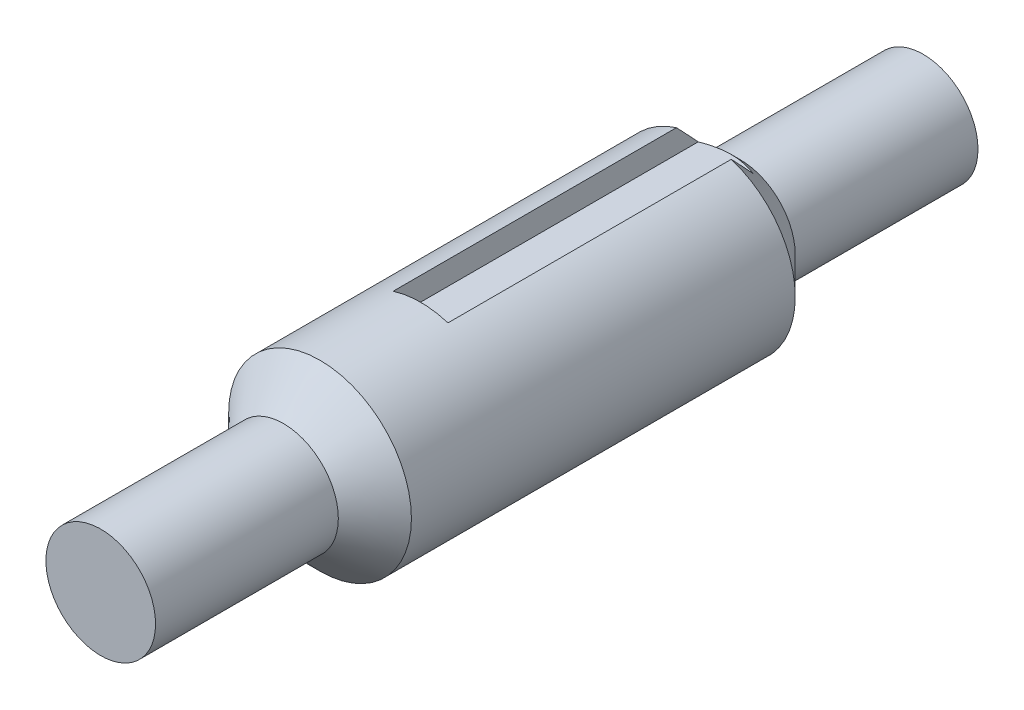
ISO-10303-21;
HEADER;
FILE_DESCRIPTION(('STEP AP214'),'2;1');
FILE_NAME('part.step','',(''),(''),'','','');
FILE_SCHEMA(('AUTOMOTIVE_DESIGN { 1 0 10303 214 1 1 1 1 }'));
ENDSEC;
DATA;
#1=APPLICATION_CONTEXT('core data for automotive mechanical design processes');
#2=APPLICATION_PROTOCOL_DEFINITION('international standard','automotive_design',2000,#1);
#3=PRODUCT_CONTEXT('',#1,'mechanical');
#4=PRODUCT('Part','Part','',(#3));
#5=PRODUCT_RELATED_PRODUCT_CATEGORY('part','',(#4));
#6=PRODUCT_DEFINITION_FORMATION('','',#4);
#7=PRODUCT_DEFINITION_CONTEXT('part definition',#1,'design');
#8=PRODUCT_DEFINITION('design','',#6,#7);
#9=PRODUCT_DEFINITION_SHAPE('','',#8);
#10=(LENGTH_UNIT() NAMED_UNIT(*) SI_UNIT(.MILLI.,.METRE.));
#11=(NAMED_UNIT(*) PLANE_ANGLE_UNIT() SI_UNIT($,.RADIAN.));
#12=(NAMED_UNIT(*) SI_UNIT($,.STERADIAN.) SOLID_ANGLE_UNIT());
#13=UNCERTAINTY_MEASURE_WITH_UNIT(LENGTH_MEASURE(1.E-05),#10,'distance_accuracy_value','');
#14=(GEOMETRIC_REPRESENTATION_CONTEXT(3) GLOBAL_UNCERTAINTY_ASSIGNED_CONTEXT((#13)) GLOBAL_UNIT_ASSIGNED_CONTEXT((#10,
#11,#12)) REPRESENTATION_CONTEXT('',''));
#15=CARTESIAN_POINT('',(0.,0.,0.));
#16=DIRECTION('',(0.,0.,1.));
#17=DIRECTION('',(1.,0.,0.));
#18=AXIS2_PLACEMENT_3D('',#15,#16,#17);
#19=CARTESIAN_POINT('',(0.,0.,30.));
#20=DIRECTION('',(0.,0.,-1.));
#21=DIRECTION('',(-1.,0.,0.));
#22=AXIS2_PLACEMENT_3D('',#19,#20,#21);
#23=CYLINDRICAL_SURFACE('',#22,10.);
#24=CARTESIAN_POINT('',(0.,0.,36.0000000000001));
#25=DIRECTION('',(0.,0.,-1.));
#26=DIRECTION('',(-1.,0.,0.));
#27=AXIS2_PLACEMENT_3D('',#24,#25,#26);
#28=CIRCLE('',#27,10.);
#29=CARTESIAN_POINT('',(-10.,0.,36.0000000000001));
#30=VERTEX_POINT('',#29);
#31=EDGE_CURVE('E11',#30,#30,#28,.T.);
#32=ORIENTED_EDGE('',*,*,#31,.T.);
#33=EDGE_LOOP('',(#32));
#34=FACE_BOUND('',#33,.T.);
#35=CARTESIAN_POINT('',(0.,0.,-6.00000000000012));
#36=DIRECTION('',(0.,0.,1.));
#37=DIRECTION('',(1.,0.,0.));
#38=AXIS2_PLACEMENT_3D('',#35,#36,#37);
#39=CIRCLE('',#38,10.);
#40=CARTESIAN_POINT('',(-3.,9.53939201416946,-6.00000000000012));
#41=VERTEX_POINT('',#40);
#42=CARTESIAN_POINT('',(3.,9.53939201416946,-6.00000000000012));
#43=VERTEX_POINT('',#42);
#44=EDGE_CURVE('E115',#41,#43,#39,.T.);
#45=ORIENTED_EDGE('',*,*,#44,.T.);
#46=DIRECTION('',(0.,0.,-1.));
#47=VECTOR('',#46,1.);
#48=CARTESIAN_POINT('',(3.,9.53939201416946,30.));
#49=LINE('',#48,#47);
#50=CARTESIAN_POINT('',(3.,9.53939201416946,25.));
#51=VERTEX_POINT('',#50);
#52=EDGE_CURVE('E65',#43,#51,#49,.F.);
#53=ORIENTED_EDGE('',*,*,#52,.T.);
#54=CARTESIAN_POINT('',(0.,0.,25.));
#55=DIRECTION('',(0.,0.,-1.));
#56=DIRECTION('',(-1.,0.,0.));
#57=AXIS2_PLACEMENT_3D('',#54,#55,#56);
#58=CIRCLE('',#57,10.);
#59=CARTESIAN_POINT('',(-3.,9.53939201416946,25.));
#60=VERTEX_POINT('',#59);
#61=EDGE_CURVE('E153',#60,#51,#58,.T.);
#62=ORIENTED_EDGE('',*,*,#61,.F.);
#63=DIRECTION('',(0.,0.,-1.));
#64=VECTOR('',#63,1.);
#65=CARTESIAN_POINT('',(-3.,9.53939201416946,30.));
#66=LINE('',#65,#64);
#67=EDGE_CURVE('E85',#60,#41,#66,.T.);
#68=ORIENTED_EDGE('',*,*,#67,.T.);
#69=EDGE_LOOP('',(#45,#53,#62,#68));
#70=FACE_BOUND('',#69,.T.);
#71=ADVANCED_FACE('F41',(#34,#70),#23,.T.);
#72=CARTESIAN_POINT('',(0.,0.,-30.));
#73=DIRECTION('',(0.,0.,1.));
#74=DIRECTION('',(1.,0.,0.));
#75=AXIS2_PLACEMENT_3D('',#72,#73,#74);
#76=CYLINDRICAL_SURFACE('',#75,6.);
#77=CARTESIAN_POINT('',(0.,0.,-10.0000000000001));
#78=DIRECTION('',(0.,0.,1.));
#79=DIRECTION('',(1.,0.,0.));
#80=AXIS2_PLACEMENT_3D('',#77,#78,#79);
#81=CIRCLE('',#80,6.);
#82=CARTESIAN_POINT('',(6.,0.,-10.0000000000001));
#83=VERTEX_POINT('',#82);
#84=EDGE_CURVE('E112',#83,#83,#81,.F.);
#85=ORIENTED_EDGE('',*,*,#84,.T.);
#86=EDGE_LOOP('',(#85));
#87=FACE_BOUND('',#86,.T.);
#88=CARTESIAN_POINT('',(0.,0.,-30.));
#89=DIRECTION('',(0.,0.,1.));
#90=DIRECTION('',(1.,0.,0.));
#91=AXIS2_PLACEMENT_3D('',#88,#89,#90);
#92=CIRCLE('',#91,6.);
#93=CARTESIAN_POINT('',(6.,0.,-30.));
#94=VERTEX_POINT('',#93);
#95=EDGE_CURVE('E109',#94,#94,#92,.T.);
#96=ORIENTED_EDGE('',*,*,#95,.T.);
#97=EDGE_LOOP('',(#96));
#98=FACE_BOUND('',#97,.T.);
#99=ADVANCED_FACE('F169',(#87,#98),#76,.T.);
#100=CARTESIAN_POINT('',(0.,0.,-30.));
#101=DIRECTION('',(0.,0.,1.));
#102=DIRECTION('',(1.,0.,0.));
#103=AXIS2_PLACEMENT_3D('',#100,#101,#102);
#104=PLANE('',#103);
#105=ORIENTED_EDGE('',*,*,#95,.F.);
#106=EDGE_LOOP('',(#105));
#107=FACE_BOUND('',#106,.T.);
#108=ADVANCED_FACE('F145',(#107),#104,.F.);
#109=CARTESIAN_POINT('',(0.,0.,0.));
#110=DIRECTION('',(0.,0.,1.));
#111=DIRECTION('',(1.,0.,0.));
#112=AXIS2_PLACEMENT_3D('',#109,#110,#111);
#113=CONICAL_SURFACE('',#112,16.0000000000002,0.785398163397453);
#114=ORIENTED_EDGE('',*,*,#84,.F.);
#115=EDGE_LOOP('',(#114));
#116=FACE_BOUND('',#115,.T.);
#117=CARTESIAN_POINT('',(-10.211302550928,7.,-3.61974556858445));
#118=CARTESIAN_POINT('',(-10.0292944119134,7.,-3.76985448552844));
#119=CARTESIAN_POINT('',(-9.84666571996909,7.,-3.91921609728615));
#120=CARTESIAN_POINT('',(-9.47997719342957,7.,-4.21618404659167));
#121=CARTESIAN_POINT('',(-9.29591731062115,7.,-4.36379032457931));
#122=CARTESIAN_POINT('',(-8.92595301289168,7.,-4.65716360924036));
#123=CARTESIAN_POINT('',(-8.7400465458349,7.,-4.80292803158371));
#124=CARTESIAN_POINT('',(-8.36639589045368,7.,-5.09208672016597));
#125=CARTESIAN_POINT('',(-8.17865169359778,7.,-5.23548097539331));
#126=CARTESIAN_POINT('',(-7.7967626611813,7.,-5.52272400687798));
#127=CARTESIAN_POINT('',(-7.60256948138443,7.,-5.66650862278348));
#128=CARTESIAN_POINT('',(-7.2116679704489,7.,-5.95061544473699));
#129=CARTESIAN_POINT('',(-7.01495969040549,7.,-6.09093772095466));
#130=CARTESIAN_POINT('',(-6.61872948543964,7.,-6.36737656495973));
#131=CARTESIAN_POINT('',(-6.4192088311898,7.,-6.50349494869155));
#132=CARTESIAN_POINT('',(-6.01684272019172,7.,-6.77071059055419));
#133=CARTESIAN_POINT('',(-5.81399744925435,7.,-6.90180812793993));
#134=CARTESIAN_POINT('',(-5.34843657679391,7.,-7.19294158220458));
#135=CARTESIAN_POINT('',(-5.08452538382529,7.,-7.3510810156381));
#136=CARTESIAN_POINT('',(-4.54941127659544,7.,-7.65442765483262));
#137=CARTESIAN_POINT('',(-4.27821059356976,7.,-7.79963876043074));
#138=CARTESIAN_POINT('',(-3.72861685691059,7.,-8.07245732488453));
#139=CARTESIAN_POINT('',(-3.45026430211088,7.,-8.20014548336112));
#140=CARTESIAN_POINT('',(-2.88440973042896,7.,-8.43339445108676));
#141=CARTESIAN_POINT('',(-2.59691278804182,7.,-8.53896729428346));
#142=CARTESIAN_POINT('',(-2.10194224676076,7.,-8.6937691220984));
#143=CARTESIAN_POINT('',(-1.89677956450506,7.,-8.75036429119206));
#144=CARTESIAN_POINT('',(-1.48266413346289,7.,-8.84753031771619));
#145=CARTESIAN_POINT('',(-1.27371191437389,7.,-8.88810339691453));
#146=CARTESIAN_POINT('',(-0.853663210143513,7.,-8.9511860136235));
#147=CARTESIAN_POINT('',(-0.642574446113337,7.,-8.97374623533142));
#148=CARTESIAN_POINT('',(-0.219210312777871,7.,-8.99975480845124));
#149=CARTESIAN_POINT('',(-0.00693498730575993,7.,-9.00320386124558));
#150=CARTESIAN_POINT('',(0.417239982449441,7.,-8.9907849245114));
#151=CARTESIAN_POINT('',(0.629139086417153,7.,-8.97489878367937));
#152=CARTESIAN_POINT('',(1.05072262413339,7.,-8.92467798293961));
#153=CARTESIAN_POINT('',(1.26040686352036,7.,-8.89034171746422));
#154=CARTESIAN_POINT('',(1.67700227469448,7.,-8.80482092810813));
#155=CARTESIAN_POINT('',(1.88390166618202,7.,-8.75357980254572));
#156=CARTESIAN_POINT('',(2.29346730336041,7.,-8.63647798329051));
#157=CARTESIAN_POINT('',(2.49613351799501,7.,-8.57061718238324));
#158=CARTESIAN_POINT('',(2.93345469620174,7.,-8.41341596910765));
#159=CARTESIAN_POINT('',(3.16722089101727,7.,-8.31961992719231));
#160=CARTESIAN_POINT('',(3.62871837957127,7.,-8.11809262722327));
#161=CARTESIAN_POINT('',(3.85644681138663,7.,-8.01035489817339));
#162=CARTESIAN_POINT('',(4.30667700481161,7.,-7.78357863520397));
#163=CARTESIAN_POINT('',(4.52916860895991,7.,-7.66452008794489));
#164=CARTESIAN_POINT('',(4.96909590833694,7.,-7.41753001157632));
#165=CARTESIAN_POINT('',(5.18653232917113,7.,-7.2895997665139));
#166=CARTESIAN_POINT('',(5.61842713748177,7.,-7.02574168623309));
#167=CARTESIAN_POINT('',(5.83285683737163,7.,-6.88976711516027));
#168=CARTESIAN_POINT('',(6.2578833438052,7.,-6.61196274602607));
#169=CARTESIAN_POINT('',(6.46848003820816,7.,-6.47013277705108));
#170=CARTESIAN_POINT('',(6.88616619076475,7.,-6.18182918632833));
#171=CARTESIAN_POINT('',(7.09325878270178,7.,-6.03536009136181));
#172=CARTESIAN_POINT('',(7.50459115137408,7.,-5.7384879588234));
#173=CARTESIAN_POINT('',(7.7088309919735,7.,-5.58808500953538));
#174=CARTESIAN_POINT('',(8.10840171516184,7.,-5.28882734018425));
#175=CARTESIAN_POINT('',(8.3038095365665,7.,-5.14007514656022));
#176=CARTESIAN_POINT('',(8.69263310802436,7.,-4.8399552219647));
#177=CARTESIAN_POINT('',(8.88604866801495,7.,-4.6885872450681));
#178=CARTESIAN_POINT('',(9.26895612912899,7.,-4.38535339285342));
#179=CARTESIAN_POINT('',(9.4584676891961,7.,-4.23351230423348));
#180=CARTESIAN_POINT('',(9.83597259372403,7.,-3.92795951495852));
#181=CARTESIAN_POINT('',(10.0239659619161,7.,-3.77424784363764));
#182=CARTESIAN_POINT('',(10.211302550928,7.,-3.61974556858445));
#183=B_SPLINE_CURVE_WITH_KNOTS('',3,(#117,#118,#119,#120,#121,#122,#123,#124,#125,#126,#127,
#128,#129,#130,#131,#132,#133,#134,#135,#136,#137,#138,#139,#140,#141,#142,#143,#144,#145,#146,
#147,#148,#149,#150,#151,#152,#153,#154,#155,#156,#157,#158,#159,#160,#161,#162,#163,#164,#165,
#166,#167,#168,#169,#170,#171,#172,#173,#174,#175,#176,#177,#178,#179,#180,#181,#182),
.UNSPECIFIED.,.F.,.F.,(4,2,2,2,2,2,2,2,2,2,2,2,2,2,2,2,2,2,2,2,2,2,2,2,2,2,2,2,2,2,2,2,4),(0.,
0.707771761934449,1.41556747110951,2.12426539832418,2.83296661715605,3.55782405260619,
4.28266678561558,5.00719190184823,5.73167666195506,6.65438825531081,7.57682056243476,
8.49485092227644,9.41238043497998,10.0503173786423,10.6881658291088,11.3242131269919,
11.9602370817004,12.5968585775543,13.2335354824895,13.8723661501129,14.5112015028036,
15.2662682660408,16.0216867570093,16.7784664522563,17.5351368425204,18.2967443024692,
19.0583740087707,19.81928213426,20.5801731980146,21.3168995872332,22.0536956213603,
22.7821974485588,23.5106878662066),.UNSPECIFIED.);
#184=CARTESIAN_POINT('',(-3.,7.,-8.38422689413618));
#185=VERTEX_POINT('',#184);
#186=CARTESIAN_POINT('',(3.,7.,-8.38422689413619));
#187=VERTEX_POINT('',#186);
#188=EDGE_CURVE('E98',#185,#187,#183,.T.);
#189=ORIENTED_EDGE('',*,*,#188,.T.);
#190=CARTESIAN_POINT('',(3.,1.99980000000003,-12.3945596607349));
#191=CARTESIAN_POINT('',(3.,2.07795026465314,-12.3511968649384));
#192=CARTESIAN_POINT('',(3.,2.15535564465244,-12.3065194835998));
#193=CARTESIAN_POINT('',(3.,2.30880734941851,-12.2149277654569));
#194=CARTESIAN_POINT('',(3.,2.38485401095059,-12.1680139938316));
#195=CARTESIAN_POINT('',(3.,2.53568730905676,-12.0723644391448));
#196=CARTESIAN_POINT('',(3.,2.61047506139149,-12.0236304077172));
#197=CARTESIAN_POINT('',(3.,2.75900189472754,-11.9245820403132));
#198=CARTESIAN_POINT('',(3.,2.83274090000158,-11.8742675910521));
#199=CARTESIAN_POINT('',(3.,3.05220739640762,-11.7215763462473));
#200=CARTESIAN_POINT('',(3.,3.19655394921722,-11.6172139514468));
#201=CARTESIAN_POINT('',(3.,3.48237952279333,-11.4045817549893));
#202=CARTESIAN_POINT('',(3.,3.62385772760313,-11.2963108651808));
#203=CARTESIAN_POINT('',(3.,3.90417737728929,-11.0770951122941));
#204=CARTESIAN_POINT('',(3.,4.04302430805072,-10.9661572457192));
#205=CARTESIAN_POINT('',(3.,4.31886747633733,-10.7420385289867));
#206=CARTESIAN_POINT('',(3.,4.45586389759417,-10.6288579043));
#207=CARTESIAN_POINT('',(3.,4.72847639015843,-10.4006313272019));
#208=CARTESIAN_POINT('',(3.,4.86409127971929,-10.2855839657262));
#209=CARTESIAN_POINT('',(3.,5.1340995029227,-10.0540635985161));
#210=CARTESIAN_POINT('',(3.,5.26849282161128,-9.93759057536999));
#211=CARTESIAN_POINT('',(3.,5.60290193592925,-9.64523741177797));
#212=CARTESIAN_POINT('',(3.,5.80229007179998,-9.46863969944634));
#213=CARTESIAN_POINT('',(3.,6.19932874145165,-9.11350450544922));
#214=CARTESIAN_POINT('',(3.,6.396979267177,-8.93496701479946));
#215=CARTESIAN_POINT('',(3.,6.79092643327565,-8.57638719741413));
#216=CARTESIAN_POINT('',(3.,6.98722300873377,-8.39634479942861));
#217=CARTESIAN_POINT('',(3.,7.3787275446927,-8.03507995093638));
#218=CARTESIAN_POINT('',(3.,7.57393550078702,-7.8538574956595));
#219=CARTESIAN_POINT('',(3.,8.15817779995601,-7.30885228201522));
#220=CARTESIAN_POINT('',(3.,8.54590243755248,-6.9436659190575));
#221=CARTESIAN_POINT('',(3.,9.31897160336601,-6.21081141666293));
#222=CARTESIAN_POINT('',(3.,9.70431620094192,-5.84314335020735));
#223=CARTESIAN_POINT('',(3.,10.4752790248694,-5.10415935888048));
#224=CARTESIAN_POINT('',(3.,10.8608885811169,-4.73283439422435));
#225=CARTESIAN_POINT('',(3.,11.6308548489459,-3.9888812505442));
#226=CARTESIAN_POINT('',(3.,12.0152115481559,-3.61625305872619));
#227=CARTESIAN_POINT('',(3.,12.7829181948144,-2.87007925592609));
#228=CARTESIAN_POINT('',(3.,13.1662682877418,-2.49653379454643));
#229=CARTESIAN_POINT('',(3.,13.9322170945337,-1.74868445519843));
#230=CARTESIAN_POINT('',(3.,14.3148158193833,-1.37438058848299));
#231=CARTESIAN_POINT('',(3.,14.6971425807876,-0.999800000000152));
#232=B_SPLINE_CURVE_WITH_KNOTS('',3,(#190,#191,#192,#193,#194,#195,#196,#197,#198,#199,#200,
#201,#202,#203,#204,#205,#206,#207,#208,#209,#210,#211,#212,#213,#214,#215,#216,#217,#218,#219,
#220,#221,#222,#223,#224,#225,#226,#227,#228,#229,#230,#231),.UNSPECIFIED.,.F.,.F.,(4,2,2,2,2,2,
2,2,2,2,2,2,2,2,2,2,2,2,2,2,4),(0.,0.268091030224563,0.53611466419274,0.803886708141486,
1.07167799003354,1.60594317262279,2.14035826311972,2.6734982362895,3.20658488060376,
3.74009458927239,4.27361082017522,5.07264266097963,5.87167820415554,6.67075179446317,
7.4698286168962,9.06769005176307,10.6655047001156,12.2714868799613,13.8774848705023,
15.483236342508,17.0889641610347),.UNSPECIFIED.);
#233=EDGE_CURVE('E147',#187,#43,#232,.T.);
#234=ORIENTED_EDGE('',*,*,#233,.T.);
#235=ORIENTED_EDGE('',*,*,#44,.F.);
#236=CARTESIAN_POINT('',(-3.,14.6971425807876,-0.99980000000015));
#237=CARTESIAN_POINT('',(-3.,14.4430937956349,-1.24871360180618));
#238=CARTESIAN_POINT('',(-3.,14.1889185860944,-1.4974982260093));
#239=CARTESIAN_POINT('',(-3.,13.6802660341529,-1.99475806465121));
#240=CARTESIAN_POINT('',(-3.,13.4257886919505,-2.24323327929306));
#241=CARTESIAN_POINT('',(-3.,12.6619908694936,-2.98796032807172));
#242=CARTESIAN_POINT('',(-3.,12.1521432105565,-3.48367181443138));
#243=CARTESIAN_POINT('',(-3.,11.1311640035339,-4.4723602276633));
#244=CARTESIAN_POINT('',(-3.,10.6200352016322,-4.96533998595183));
#245=CARTESIAN_POINT('',(-3.,9.85102472377835,-5.70255196871473));
#246=CARTESIAN_POINT('',(-3.,9.59426173064645,-5.94795086022426));
#247=CARTESIAN_POINT('',(-3.,9.07978911241587,-6.43776416967591));
#248=CARTESIAN_POINT('',(-3.,8.82207947058895,-6.6821785700595));
#249=CARTESIAN_POINT('',(-3.,8.30482140471497,-7.17034960815283));
#250=CARTESIAN_POINT('',(-3.,8.0452699987247,-7.41410308857993));
#251=CARTESIAN_POINT('',(-3.,7.52462402878752,-7.89992675608849));
#252=CARTESIAN_POINT('',(-3.,7.26352956005868,-8.14199704506944));
#253=CARTESIAN_POINT('',(-3.,6.73948311054954,-8.62368761560854));
#254=CARTESIAN_POINT('',(-3.,6.47653282977116,-8.86330974455613));
#255=CARTESIAN_POINT('',(-3.,5.94775055115667,-9.33948700878655));
#256=CARTESIAN_POINT('',(-3.,5.6819179173756,-9.57604144086479));
#257=CARTESIAN_POINT('',(-3.,5.27979020913496,-9.92776863965263));
#258=CARTESIAN_POINT('',(-3.,5.14499405876209,-10.0446545466363));
#259=CARTESIAN_POINT('',(-3.,4.87417901989314,-10.2769967181868));
#260=CARTESIAN_POINT('',(-3.,4.73816016201025,-10.3924530183759));
#261=CARTESIAN_POINT('',(-3.,4.46471691917455,-10.6215128213819));
#262=CARTESIAN_POINT('',(-3.,4.3272934909453,-10.7351174642878));
#263=CARTESIAN_POINT('',(-3.,4.05059166239266,-10.9600797894256));
#264=CARTESIAN_POINT('',(-3.,3.91131307981687,-11.0714372481483));
#265=CARTESIAN_POINT('',(-3.,3.63002338226142,-11.2915634504621));
#266=CARTESIAN_POINT('',(-3.,3.48800514554235,-11.400323117554));
#267=CARTESIAN_POINT('',(-3.,3.20108435103914,-11.613914905465));
#268=CARTESIAN_POINT('',(-3.,3.05618261520574,-11.7187481216534));
#269=CARTESIAN_POINT('',(-3.,2.83588015063848,-11.8721136010535));
#270=CARTESIAN_POINT('',(-3.,2.76186914850356,-11.9226428639651));
#271=CARTESIAN_POINT('',(-3.,2.61279170882665,-12.0221116816079));
#272=CARTESIAN_POINT('',(-3.,2.53772534815567,-12.0710513512722));
#273=CARTESIAN_POINT('',(-3.,2.38632620696579,-12.1671006923026));
#274=CARTESIAN_POINT('',(-3.,2.30999229884821,-12.21420859426));
#275=CARTESIAN_POINT('',(-3.,2.155956039464,-12.3061727943585));
#276=CARTESIAN_POINT('',(-3.,2.0782533460162,-12.3510285183721));
#277=CARTESIAN_POINT('',(-3.,1.99980000000003,-12.3945596607349));
#278=B_SPLINE_CURVE_WITH_KNOTS('',3,(#236,#237,#238,#239,#240,#241,#242,#243,#244,#245,#246,
#247,#248,#249,#250,#251,#252,#253,#254,#255,#256,#257,#258,#259,#260,#261,#262,#263,#264,#265,
#266,#267,#268,#269,#270,#271,#272,#273,#274,#275,#276,#277),.UNSPECIFIED.,.F.,.F.,(4,2,2,2,2,2,
2,2,2,2,2,2,2,2,2,2,2,2,2,2,4),(0.,1.06699993673606,2.13399917283503,4.26731957661029,
6.39769325359318,7.46321026115766,8.52874618894642,9.59693760777743,10.6650637857913,
11.7323135012383,12.7998036840701,13.3350445424548,13.870272037017,14.4051564869548,
14.9400938778822,15.4766865295738,16.0131283548064,16.2819567758492,16.5507657161817,
16.8198281714147,17.0889588716607),.UNSPECIFIED.);
#279=EDGE_CURVE('E118',#41,#185,#278,.T.);
#280=ORIENTED_EDGE('',*,*,#279,.T.);
#281=EDGE_LOOP('',(#189,#234,#235,#280));
#282=FACE_BOUND('',#281,.T.);
#283=ADVANCED_FACE('F132',(#116,#282),#113,.T.);
#284=CARTESIAN_POINT('',(0.,0.,25.));
#285=DIRECTION('',(0.,0.,-1.));
#286=DIRECTION('',(-1.,0.,0.));
#287=AXIS2_PLACEMENT_3D('',#284,#285,#286);
#288=PLANE('',#287);
#289=ORIENTED_EDGE('',*,*,#61,.T.);
#290=DIRECTION('',(0.,1.,0.));
#291=VECTOR('',#290,1.);
#292=CARTESIAN_POINT('',(3.,7.,25.));
#293=LINE('',#292,#291);
#294=CARTESIAN_POINT('',(3.,7.,25.));
#295=VERTEX_POINT('',#294);
#296=EDGE_CURVE('E90',#295,#51,#293,.T.);
#297=ORIENTED_EDGE('',*,*,#296,.F.);
#298=DIRECTION('',(1.,0.,0.));
#299=VECTOR('',#298,1.);
#300=CARTESIAN_POINT('',(-3.,7.,25.));
#301=LINE('',#300,#299);
#302=CARTESIAN_POINT('',(-3.,7.,25.));
#303=VERTEX_POINT('',#302);
#304=EDGE_CURVE('E89',#303,#295,#301,.T.);
#305=ORIENTED_EDGE('',*,*,#304,.F.);
#306=DIRECTION('',(0.,-1.,0.));
#307=VECTOR('',#306,1.);
#308=CARTESIAN_POINT('',(-3.,7.,25.));
#309=LINE('',#308,#307);
#310=EDGE_CURVE('E82',#60,#303,#309,.T.);
#311=ORIENTED_EDGE('',*,*,#310,.F.);
#312=EDGE_LOOP('',(#289,#297,#305,#311));
#313=FACE_BOUND('',#312,.T.);
#314=ADVANCED_FACE('F102',(#313),#288,.T.);
#315=CARTESIAN_POINT('',(3.,7.,-30.));
#316=DIRECTION('',(1.,0.,0.));
#317=DIRECTION('',(0.,0.,-1.));
#318=AXIS2_PLACEMENT_3D('',#315,#316,#317);
#319=PLANE('',#318);
#320=ORIENTED_EDGE('',*,*,#233,.F.);
#321=DIRECTION('',(0.,0.,1.));
#322=VECTOR('',#321,1.);
#323=CARTESIAN_POINT('',(3.,7.,-30.));
#324=LINE('',#323,#322);
#325=EDGE_CURVE('E100',#187,#295,#324,.T.);
#326=ORIENTED_EDGE('',*,*,#325,.T.);
#327=ORIENTED_EDGE('',*,*,#296,.T.);
#328=ORIENTED_EDGE('',*,*,#52,.F.);
#329=EDGE_LOOP('',(#320,#326,#327,#328));
#330=FACE_BOUND('',#329,.T.);
#331=ADVANCED_FACE('F141',(#330),#319,.F.);
#332=CARTESIAN_POINT('',(-3.,7.,-30.));
#333=DIRECTION('',(0.,-1.,0.));
#334=DIRECTION('',(0.,0.,-1.));
#335=AXIS2_PLACEMENT_3D('',#332,#333,#334);
#336=PLANE('',#335);
#337=DIRECTION('',(0.,0.,1.));
#338=VECTOR('',#337,1.);
#339=CARTESIAN_POINT('',(-3.,7.,-30.));
#340=LINE('',#339,#338);
#341=EDGE_CURVE('E57',#185,#303,#340,.T.);
#342=ORIENTED_EDGE('',*,*,#341,.T.);
#343=ORIENTED_EDGE('',*,*,#304,.T.);
#344=ORIENTED_EDGE('',*,*,#325,.F.);
#345=ORIENTED_EDGE('',*,*,#188,.F.);
#346=EDGE_LOOP('',(#342,#343,#344,#345));
#347=FACE_BOUND('',#346,.T.);
#348=ADVANCED_FACE('F94',(#347),#336,.F.);
#349=CARTESIAN_POINT('',(-3.,7.,-30.));
#350=DIRECTION('',(-1.,0.,0.));
#351=DIRECTION('',(0.,0.,1.));
#352=AXIS2_PLACEMENT_3D('',#349,#350,#351);
#353=PLANE('',#352);
#354=ORIENTED_EDGE('',*,*,#310,.T.);
#355=ORIENTED_EDGE('',*,*,#341,.F.);
#356=ORIENTED_EDGE('',*,*,#279,.F.);
#357=ORIENTED_EDGE('',*,*,#67,.F.);
#358=EDGE_LOOP('',(#354,#355,#356,#357));
#359=FACE_BOUND('',#358,.T.);
#360=ADVANCED_FACE('F83',(#359),#353,.F.);
#361=CARTESIAN_POINT('',(0.,0.,60.));
#362=DIRECTION('',(0.,0.,-1.));
#363=DIRECTION('',(-1.,0.,0.));
#364=AXIS2_PLACEMENT_3D('',#361,#362,#363);
#365=CYLINDRICAL_SURFACE('',#364,6.);
#366=CARTESIAN_POINT('',(0.,0.,40.0000000000002));
#367=DIRECTION('',(0.,0.,1.));
#368=DIRECTION('',(1.,0.,0.));
#369=AXIS2_PLACEMENT_3D('',#366,#367,#368);
#370=CIRCLE('',#369,6.);
#371=CARTESIAN_POINT('',(6.,0.,40.0000000000002));
#372=VERTEX_POINT('',#371);
#373=EDGE_CURVE('E50',#372,#372,#370,.T.);
#374=ORIENTED_EDGE('',*,*,#373,.T.);
#375=EDGE_LOOP('',(#374));
#376=FACE_BOUND('',#375,.T.);
#377=CARTESIAN_POINT('',(0.,0.,60.));
#378=DIRECTION('',(0.,0.,1.));
#379=DIRECTION('',(1.,0.,0.));
#380=AXIS2_PLACEMENT_3D('',#377,#378,#379);
#381=CIRCLE('',#380,6.);
#382=CARTESIAN_POINT('',(6.,0.,60.));
#383=VERTEX_POINT('',#382);
#384=EDGE_CURVE('E178',#383,#383,#381,.T.);
#385=ORIENTED_EDGE('',*,*,#384,.F.);
#386=EDGE_LOOP('',(#385));
#387=FACE_BOUND('',#386,.T.);
#388=ADVANCED_FACE('F138',(#376,#387),#365,.T.);
#389=CARTESIAN_POINT('',(0.,0.,60.));
#390=DIRECTION('',(0.,0.,1.));
#391=DIRECTION('',(1.,0.,0.));
#392=AXIS2_PLACEMENT_3D('',#389,#390,#391);
#393=PLANE('',#392);
#394=ORIENTED_EDGE('',*,*,#384,.T.);
#395=EDGE_LOOP('',(#394));
#396=FACE_BOUND('',#395,.T.);
#397=ADVANCED_FACE('F160',(#396),#393,.T.);
#398=CARTESIAN_POINT('',(0.,0.,40.0000000000002));
#399=DIRECTION('',(0.,0.,-1.));
#400=DIRECTION('',(-1.,0.,0.));
#401=AXIS2_PLACEMENT_3D('',#398,#399,#400);
#402=CONICAL_SURFACE('',#401,6.,0.785398163397443);
#403=ORIENTED_EDGE('',*,*,#31,.F.);
#404=EDGE_LOOP('',(#403));
#405=FACE_BOUND('',#404,.T.);
#406=ORIENTED_EDGE('',*,*,#373,.F.);
#407=EDGE_LOOP('',(#406));
#408=FACE_BOUND('',#407,.T.);
#409=ADVANCED_FACE('F44',(#405,#408),#402,.T.);
#410=CLOSED_SHELL('',(#71,#99,#108,#283,#314,#331,#348,#360,#388,#397,#409));
#411=MANIFOLD_SOLID_BREP('B2',#410);
#412=ADVANCED_BREP_SHAPE_REPRESENTATION('',(#18,#411),#14);
#413=SHAPE_DEFINITION_REPRESENTATION(#9,#412);
ENDSEC;
END-ISO-10303-21;
